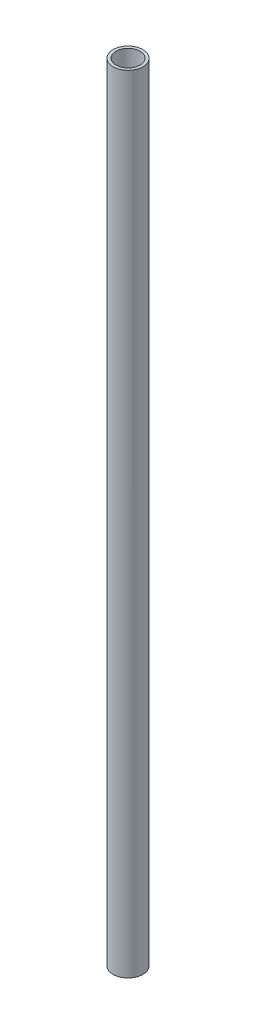
ISO-10303-21;
HEADER;
FILE_DESCRIPTION(('STEP AP214'),'2;1');
FILE_NAME('part.step','',(''),(''),'','','');
FILE_SCHEMA(('AUTOMOTIVE_DESIGN { 1 0 10303 214 1 1 1 1 }'));
ENDSEC;
DATA;
#1=APPLICATION_CONTEXT('core data for automotive mechanical design processes');
#2=APPLICATION_PROTOCOL_DEFINITION('international standard','automotive_design',2000,#1);
#3=PRODUCT_CONTEXT('',#1,'mechanical');
#4=PRODUCT('Part','Part','',(#3));
#5=PRODUCT_RELATED_PRODUCT_CATEGORY('part','',(#4));
#6=PRODUCT_DEFINITION_FORMATION('','',#4);
#7=PRODUCT_DEFINITION_CONTEXT('part definition',#1,'design');
#8=PRODUCT_DEFINITION('design','',#6,#7);
#9=PRODUCT_DEFINITION_SHAPE('','',#8);
#10=(LENGTH_UNIT() NAMED_UNIT(*) SI_UNIT(.MILLI.,.METRE.));
#11=(NAMED_UNIT(*) PLANE_ANGLE_UNIT() SI_UNIT($,.RADIAN.));
#12=(NAMED_UNIT(*) SI_UNIT($,.STERADIAN.) SOLID_ANGLE_UNIT());
#13=UNCERTAINTY_MEASURE_WITH_UNIT(LENGTH_MEASURE(1.E-05),#10,'distance_accuracy_value','');
#14=(GEOMETRIC_REPRESENTATION_CONTEXT(3) GLOBAL_UNCERTAINTY_ASSIGNED_CONTEXT((#13)) GLOBAL_UNIT_ASSIGNED_CONTEXT((#10,
#11,#12)) REPRESENTATION_CONTEXT('',''));
#15=CARTESIAN_POINT('',(0.,0.,0.));
#16=DIRECTION('',(0.,0.,1.));
#17=DIRECTION('',(1.,0.,0.));
#18=AXIS2_PLACEMENT_3D('',#15,#16,#17);
#19=CARTESIAN_POINT('',(0.,0.,0.));
#20=DIRECTION('',(0.,1.,0.));
#21=DIRECTION('',(0.,0.,1.));
#22=AXIS2_PLACEMENT_3D('',#19,#20,#21);
#23=PLANE('',#22);
#24=CARTESIAN_POINT('',(0.,0.,0.));
#25=DIRECTION('',(0.,1.,0.));
#26=DIRECTION('',(0.,0.,1.));
#27=AXIS2_PLACEMENT_3D('',#24,#25,#26);
#28=CIRCLE('',#27,0.3977);
#29=CARTESIAN_POINT('',(0.,0.,0.3977));
#30=VERTEX_POINT('',#29);
#31=EDGE_CURVE('E38',#30,#30,#28,.T.);
#32=ORIENTED_EDGE('',*,*,#31,.F.);
#33=EDGE_LOOP('',(#32));
#34=FACE_BOUND('',#33,.T.);
#35=CARTESIAN_POINT('',(0.,0.,0.));
#36=DIRECTION('',(0.,1.,0.));
#37=DIRECTION('',(0.,0.,1.));
#38=AXIS2_PLACEMENT_3D('',#35,#36,#37);
#39=CIRCLE('',#38,0.3215);
#40=CARTESIAN_POINT('',(0.,0.,0.3215));
#41=VERTEX_POINT('',#40);
#42=EDGE_CURVE('E47',#41,#41,#39,.T.);
#43=ORIENTED_EDGE('',*,*,#42,.T.);
#44=EDGE_LOOP('',(#43));
#45=FACE_BOUND('',#44,.T.);
#46=ADVANCED_FACE('F31',(#34,#45),#23,.F.);
#47=CARTESIAN_POINT('',(0.,22.1248654675116,0.));
#48=DIRECTION('',(0.,-1.,0.));
#49=DIRECTION('',(0.,0.,-1.));
#50=AXIS2_PLACEMENT_3D('',#47,#48,#49);
#51=CYLINDRICAL_SURFACE('',#50,0.3977);
#52=CARTESIAN_POINT('',(0.,21.,0.));
#53=DIRECTION('',(0.,-1.,0.));
#54=DIRECTION('',(0.,0.,-1.));
#55=AXIS2_PLACEMENT_3D('',#52,#53,#54);
#56=CIRCLE('',#55,0.3977);
#57=CARTESIAN_POINT('',(0.,21.,-0.3977));
#58=VERTEX_POINT('',#57);
#59=EDGE_CURVE('E42',#58,#58,#56,.T.);
#60=ORIENTED_EDGE('',*,*,#59,.T.);
#61=EDGE_LOOP('',(#60));
#62=FACE_BOUND('',#61,.T.);
#63=ORIENTED_EDGE('',*,*,#31,.T.);
#64=EDGE_LOOP('',(#63));
#65=FACE_BOUND('',#64,.T.);
#66=ADVANCED_FACE('F55',(#62,#65),#51,.T.);
#67=CARTESIAN_POINT('',(0.,22.1248654675116,0.));
#68=DIRECTION('',(0.,-1.,0.));
#69=DIRECTION('',(0.,0.,-1.));
#70=AXIS2_PLACEMENT_3D('',#67,#68,#69);
#71=CYLINDRICAL_SURFACE('',#70,0.3215);
#72=CARTESIAN_POINT('',(0.,21.,0.));
#73=DIRECTION('',(0.,-1.,0.));
#74=DIRECTION('',(0.,0.,-1.));
#75=AXIS2_PLACEMENT_3D('',#72,#73,#74);
#76=CIRCLE('',#75,0.3215);
#77=CARTESIAN_POINT('',(0.,21.,-0.3215));
#78=VERTEX_POINT('',#77);
#79=EDGE_CURVE('E10',#78,#78,#76,.T.);
#80=ORIENTED_EDGE('',*,*,#79,.F.);
#81=EDGE_LOOP('',(#80));
#82=FACE_BOUND('',#81,.T.);
#83=ORIENTED_EDGE('',*,*,#42,.F.);
#84=EDGE_LOOP('',(#83));
#85=FACE_BOUND('',#84,.T.);
#86=ADVANCED_FACE('F53',(#82,#85),#71,.F.);
#87=CARTESIAN_POINT('',(0.,21.,0.));
#88=DIRECTION('',(0.,-1.,0.));
#89=DIRECTION('',(-0.228621711480542,0.,-0.973515337855397));
#90=AXIS2_PLACEMENT_3D('',#87,#88,#89);
#91=PLANE('',#90);
#92=ORIENTED_EDGE('',*,*,#79,.T.);
#93=EDGE_LOOP('',(#92));
#94=FACE_BOUND('',#93,.T.);
#95=ORIENTED_EDGE('',*,*,#59,.F.);
#96=EDGE_LOOP('',(#95));
#97=FACE_BOUND('',#96,.T.);
#98=ADVANCED_FACE('F33',(#94,#97),#91,.F.);
#99=CLOSED_SHELL('',(#46,#66,#86,#98));
#100=MANIFOLD_SOLID_BREP('B2',#99);
#101=ADVANCED_BREP_SHAPE_REPRESENTATION('',(#18,#100),#14);
#102=SHAPE_DEFINITION_REPRESENTATION(#9,#101);
ENDSEC;
END-ISO-10303-21;
